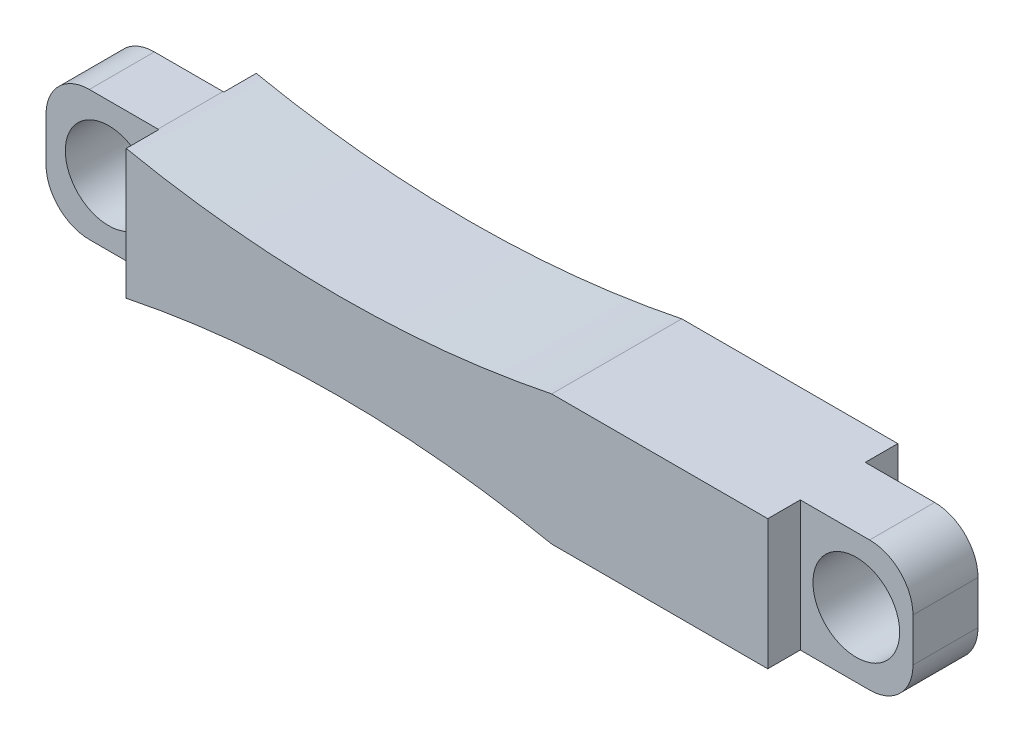
ISO-10303-21;
HEADER;
FILE_DESCRIPTION(('STEP AP214'),'2;1');
FILE_NAME('part.step','',(''),(''),'','','');
FILE_SCHEMA(('AUTOMOTIVE_DESIGN { 1 0 10303 214 1 1 1 1 }'));
ENDSEC;
DATA;
#1=APPLICATION_CONTEXT('core data for automotive mechanical design processes');
#2=APPLICATION_PROTOCOL_DEFINITION('international standard','automotive_design',2000,#1);
#3=PRODUCT_CONTEXT('',#1,'mechanical');
#4=PRODUCT('Part','Part','',(#3));
#5=PRODUCT_RELATED_PRODUCT_CATEGORY('part','',(#4));
#6=PRODUCT_DEFINITION_FORMATION('','',#4);
#7=PRODUCT_DEFINITION_CONTEXT('part definition',#1,'design');
#8=PRODUCT_DEFINITION('design','',#6,#7);
#9=PRODUCT_DEFINITION_SHAPE('','',#8);
#10=(LENGTH_UNIT() NAMED_UNIT(*) SI_UNIT(.MILLI.,.METRE.));
#11=(NAMED_UNIT(*) PLANE_ANGLE_UNIT() SI_UNIT($,.RADIAN.));
#12=(NAMED_UNIT(*) SI_UNIT($,.STERADIAN.) SOLID_ANGLE_UNIT());
#13=UNCERTAINTY_MEASURE_WITH_UNIT(LENGTH_MEASURE(1.E-05),#10,'distance_accuracy_value','');
#14=(GEOMETRIC_REPRESENTATION_CONTEXT(3) GLOBAL_UNCERTAINTY_ASSIGNED_CONTEXT((#13)) GLOBAL_UNIT_ASSIGNED_CONTEXT((#10,
#11,#12)) REPRESENTATION_CONTEXT('',''));
#15=CARTESIAN_POINT('',(0.,0.,0.));
#16=DIRECTION('',(0.,0.,1.));
#17=DIRECTION('',(1.,0.,0.));
#18=AXIS2_PLACEMENT_3D('',#15,#16,#17);
#19=CARTESIAN_POINT('',(-150.33482437737,14.3918732714698,75.));
#20=DIRECTION('',(0.,0.,1.));
#21=DIRECTION('',(1.,0.,0.));
#22=AXIS2_PLACEMENT_3D('',#19,#20,#21);
#23=PLANE('',#22);
#24=CARTESIAN_POINT('',(-65.295953132402,1011.91743228915,75.));
#25=DIRECTION('',(0.,0.,1.));
#26=DIRECTION('',(1.,0.,0.));
#27=AXIS2_PLACEMENT_3D('',#24,#25,#26);
#28=CIRCLE('',#27,976.713794307517);
#29=CARTESIAN_POINT('',(-261.295953153205,55.071657891603,75.));
#30=VERTEX_POINT('',#29);
#31=CARTESIAN_POINT('',(131.347256168401,55.2036379773523,75.));
#32=VERTEX_POINT('',#31);
#33=EDGE_CURVE('E284',#30,#32,#28,.T.);
#34=ORIENTED_EDGE('',*,*,#33,.F.);
#35=DIRECTION('',(0.,1.,0.));
#36=VECTOR('',#35,1.);
#37=CARTESIAN_POINT('',(-261.295953153205,55.2036379773522,75.));
#38=LINE('',#37,#36);
#39=CARTESIAN_POINT('',(-261.295953153205,-64.6644182061334,75.));
#40=VERTEX_POINT('',#39);
#41=EDGE_CURVE('E65',#40,#30,#38,.T.);
#42=ORIENTED_EDGE('',*,*,#41,.F.);
#43=CARTESIAN_POINT('',(-65.2959531532047,-1021.77323976221,75.));
#44=DIRECTION('',(0.,0.,1.));
#45=DIRECTION('',(-1.,0.,0.));
#46=AXIS2_PLACEMENT_3D('',#43,#44,#45);
#47=CIRCLE('',#46,976.97149206129);
#48=CARTESIAN_POINT('',(131.347256168401,-64.7963620226478,75.));
#49=VERTEX_POINT('',#48);
#50=EDGE_CURVE('E279',#49,#40,#47,.T.);
#51=ORIENTED_EDGE('',*,*,#50,.F.);
#52=DIRECTION('',(1.,0.,0.));
#53=VECTOR('',#52,1.);
#54=CARTESIAN_POINT('',(-365.295953153205,-64.7963620226478,75.));
#55=LINE('',#54,#53);
#56=CARTESIAN_POINT('',(330.704046846795,-64.7963620226478,75.));
#57=VERTEX_POINT('',#56);
#58=EDGE_CURVE('E306',#49,#57,#55,.T.);
#59=ORIENTED_EDGE('',*,*,#58,.T.);
#60=DIRECTION('',(0.,-1.,0.));
#61=VECTOR('',#60,1.);
#62=CARTESIAN_POINT('',(330.704046846795,55.2036379773522,75.));
#63=LINE('',#62,#61);
#64=CARTESIAN_POINT('',(330.704046846795,55.2036379773522,75.));
#65=VERTEX_POINT('',#64);
#66=EDGE_CURVE('E259',#65,#57,#63,.T.);
#67=ORIENTED_EDGE('',*,*,#66,.F.);
#68=DIRECTION('',(-1.,0.,0.));
#69=VECTOR('',#68,1.);
#70=CARTESIAN_POINT('',(-365.295953153205,55.2036379773522,75.));
#71=LINE('',#70,#69);
#72=EDGE_CURVE('E310',#65,#32,#71,.T.);
#73=ORIENTED_EDGE('',*,*,#72,.T.);
#74=EDGE_LOOP('',(#34,#42,#51,#59,#67,#73));
#75=FACE_BOUND('',#74,.T.);
#76=ADVANCED_FACE('F39',(#75),#23,.T.);
#77=CARTESIAN_POINT('',(-150.33482437737,14.3918732714698,-45.));
#78=DIRECTION('',(0.,0.,1.));
#79=DIRECTION('',(1.,0.,0.));
#80=AXIS2_PLACEMENT_3D('',#77,#78,#79);
#81=PLANE('',#80);
#82=CARTESIAN_POINT('',(-65.2959531532047,-1021.77323976221,-45.));
#83=DIRECTION('',(0.,0.,1.));
#84=DIRECTION('',(-1.,0.,0.));
#85=AXIS2_PLACEMENT_3D('',#82,#83,#84);
#86=CIRCLE('',#85,976.97149206129);
#87=CARTESIAN_POINT('',(131.347256168401,-64.7963620226478,-45.));
#88=VERTEX_POINT('',#87);
#89=CARTESIAN_POINT('',(-261.295953153205,-64.6644182061334,-45.));
#90=VERTEX_POINT('',#89);
#91=EDGE_CURVE('E296',#88,#90,#86,.T.);
#92=ORIENTED_EDGE('',*,*,#91,.T.);
#93=DIRECTION('',(0.,-1.,0.));
#94=VECTOR('',#93,1.);
#95=CARTESIAN_POINT('',(-261.295953153205,55.2036379773522,-45.));
#96=LINE('',#95,#94);
#97=CARTESIAN_POINT('',(-261.295953153205,55.0716578916029,-45.));
#98=VERTEX_POINT('',#97);
#99=EDGE_CURVE('E180',#98,#90,#96,.T.);
#100=ORIENTED_EDGE('',*,*,#99,.F.);
#101=CARTESIAN_POINT('',(-65.295953132402,1011.91743228915,-45.));
#102=DIRECTION('',(0.,0.,1.));
#103=DIRECTION('',(1.,0.,0.));
#104=AXIS2_PLACEMENT_3D('',#101,#102,#103);
#105=CIRCLE('',#104,976.713794307517);
#106=CARTESIAN_POINT('',(131.347256168401,55.2036379773522,-45.));
#107=VERTEX_POINT('',#106);
#108=EDGE_CURVE('E280',#98,#107,#105,.T.);
#109=ORIENTED_EDGE('',*,*,#108,.T.);
#110=DIRECTION('',(-1.,0.,0.));
#111=VECTOR('',#110,1.);
#112=CARTESIAN_POINT('',(-365.295953153205,55.2036379773522,-45.));
#113=LINE('',#112,#111);
#114=CARTESIAN_POINT('',(330.704046846795,55.2036379773522,-45.));
#115=VERTEX_POINT('',#114);
#116=EDGE_CURVE('E311',#115,#107,#113,.T.);
#117=ORIENTED_EDGE('',*,*,#116,.F.);
#118=DIRECTION('',(0.,1.,0.));
#119=VECTOR('',#118,1.);
#120=CARTESIAN_POINT('',(330.704046846795,55.2036379773522,-45.));
#121=LINE('',#120,#119);
#122=CARTESIAN_POINT('',(330.704046846795,-64.7963620226478,-45.));
#123=VERTEX_POINT('',#122);
#124=EDGE_CURVE('E226',#123,#115,#121,.T.);
#125=ORIENTED_EDGE('',*,*,#124,.F.);
#126=DIRECTION('',(1.,0.,0.));
#127=VECTOR('',#126,1.);
#128=CARTESIAN_POINT('',(-365.295953153205,-64.7963620226478,-45.));
#129=LINE('',#128,#127);
#130=EDGE_CURVE('E292',#88,#123,#129,.T.);
#131=ORIENTED_EDGE('',*,*,#130,.F.);
#132=EDGE_LOOP('',(#92,#100,#109,#117,#125,#131));
#133=FACE_BOUND('',#132,.T.);
#134=ADVANCED_FACE('F433',(#133),#81,.F.);
#135=CARTESIAN_POINT('',(-365.295953153205,-64.7963620226478,75.));
#136=DIRECTION('',(0.,1.,0.));
#137=DIRECTION('',(0.,0.,1.));
#138=AXIS2_PLACEMENT_3D('',#135,#136,#137);
#139=PLANE('',#138);
#140=DIRECTION('',(0.,0.,1.));
#141=VECTOR('',#140,1.);
#142=CARTESIAN_POINT('',(-261.93916247481,-64.7963620226478,-45.));
#143=LINE('',#142,#141);
#144=CARTESIAN_POINT('',(-261.93916247481,-64.7963620226478,-15.));
#145=VERTEX_POINT('',#144);
#146=CARTESIAN_POINT('',(-261.93916247481,-64.7963620226478,45.));
#147=VERTEX_POINT('',#146);
#148=EDGE_CURVE('E202',#145,#147,#143,.T.);
#149=ORIENTED_EDGE('',*,*,#148,.T.);
#150=DIRECTION('',(-1.,0.,0.));
#151=VECTOR('',#150,1.);
#152=CARTESIAN_POINT('',(-261.295953153205,-64.7963620226478,45.));
#153=LINE('',#152,#151);
#154=CARTESIAN_POINT('',(-325.295953153205,-64.7963620226478,45.));
#155=VERTEX_POINT('',#154);
#156=EDGE_CURVE('E186',#147,#155,#153,.T.);
#157=ORIENTED_EDGE('',*,*,#156,.T.);
#158=DIRECTION('',(0.,0.,-1.));
#159=VECTOR('',#158,1.);
#160=CARTESIAN_POINT('',(-325.295953153205,-64.7963620226478,75.));
#161=LINE('',#160,#159);
#162=CARTESIAN_POINT('',(-325.295953153205,-64.7963620226478,-15.));
#163=VERTEX_POINT('',#162);
#164=EDGE_CURVE('E341',#155,#163,#161,.T.);
#165=ORIENTED_EDGE('',*,*,#164,.T.);
#166=DIRECTION('',(-1.,0.,0.));
#167=VECTOR('',#166,1.);
#168=CARTESIAN_POINT('',(-261.295953153205,-64.7963620226478,-15.));
#169=LINE('',#168,#167);
#170=EDGE_CURVE('E393',#145,#163,#169,.T.);
#171=ORIENTED_EDGE('',*,*,#170,.F.);
#172=EDGE_LOOP('',(#149,#157,#165,#171));
#173=FACE_BOUND('',#172,.T.);
#174=ADVANCED_FACE('F430',(#173),#139,.F.);
#175=CARTESIAN_POINT('',(-365.295953153205,55.2036379773522,75.));
#176=DIRECTION('',(0.,-1.,0.));
#177=DIRECTION('',(0.,0.,-1.));
#178=AXIS2_PLACEMENT_3D('',#175,#176,#177);
#179=PLANE('',#178);
#180=DIRECTION('',(0.,0.,-1.));
#181=VECTOR('',#180,1.);
#182=CARTESIAN_POINT('',(394.704046846795,55.2036379773522,75.));
#183=LINE('',#182,#181);
#184=CARTESIAN_POINT('',(394.704046846795,55.2036379773522,45.));
#185=VERTEX_POINT('',#184);
#186=CARTESIAN_POINT('',(394.704046846795,55.2036379773522,-15.));
#187=VERTEX_POINT('',#186);
#188=EDGE_CURVE('E329',#185,#187,#183,.T.);
#189=ORIENTED_EDGE('',*,*,#188,.T.);
#190=DIRECTION('',(1.,0.,0.));
#191=VECTOR('',#190,1.);
#192=CARTESIAN_POINT('',(330.704046846795,55.2036379773522,-15.));
#193=LINE('',#192,#191);
#194=CARTESIAN_POINT('',(330.704046846795,55.2036379773522,-15.));
#195=VERTEX_POINT('',#194);
#196=EDGE_CURVE('E241',#195,#187,#193,.T.);
#197=ORIENTED_EDGE('',*,*,#196,.F.);
#198=DIRECTION('',(0.,0.,1.));
#199=VECTOR('',#198,1.);
#200=CARTESIAN_POINT('',(330.704046846795,55.2036379773522,-15.));
#201=LINE('',#200,#199);
#202=EDGE_CURVE('E229',#115,#195,#201,.T.);
#203=ORIENTED_EDGE('',*,*,#202,.F.);
#204=ORIENTED_EDGE('',*,*,#116,.T.);
#205=DIRECTION('',(0.,0.,1.));
#206=VECTOR('',#205,1.);
#207=CARTESIAN_POINT('',(131.347256168401,55.2036379773523,-45.));
#208=LINE('',#207,#206);
#209=EDGE_CURVE('E283',#107,#32,#208,.T.);
#210=ORIENTED_EDGE('',*,*,#209,.T.);
#211=ORIENTED_EDGE('',*,*,#72,.F.);
#212=DIRECTION('',(0.,0.,1.));
#213=VECTOR('',#212,1.);
#214=CARTESIAN_POINT('',(330.704046846795,55.2036379773522,45.));
#215=LINE('',#214,#213);
#216=CARTESIAN_POINT('',(330.704046846795,55.2036379773522,45.));
#217=VERTEX_POINT('',#216);
#218=EDGE_CURVE('E256',#217,#65,#215,.T.);
#219=ORIENTED_EDGE('',*,*,#218,.F.);
#220=DIRECTION('',(1.,0.,0.));
#221=VECTOR('',#220,1.);
#222=CARTESIAN_POINT('',(330.704046846795,55.2036379773522,45.));
#223=LINE('',#222,#221);
#224=EDGE_CURVE('E266',#217,#185,#223,.T.);
#225=ORIENTED_EDGE('',*,*,#224,.T.);
#226=EDGE_LOOP('',(#189,#197,#203,#204,#210,#211,#219,#225));
#227=FACE_BOUND('',#226,.T.);
#228=ADVANCED_FACE('F432',(#227),#179,.F.);
#229=CARTESIAN_POINT('',(-365.295953153205,55.2036379773522,75.));
#230=DIRECTION('',(1.,0.,0.));
#231=DIRECTION('',(0.,0.,-1.));
#232=AXIS2_PLACEMENT_3D('',#229,#230,#231);
#233=PLANE('',#232);
#234=DIRECTION('',(0.,0.,-1.));
#235=VECTOR('',#234,1.);
#236=CARTESIAN_POINT('',(-365.295953153205,-24.7963620226478,75.));
#237=LINE('',#236,#235);
#238=CARTESIAN_POINT('',(-365.295953153205,-24.7963620226478,-15.));
#239=VERTEX_POINT('',#238);
#240=CARTESIAN_POINT('',(-365.295953153205,-24.7963620226478,45.));
#241=VERTEX_POINT('',#240);
#242=EDGE_CURVE('E315',#239,#241,#237,.F.);
#243=ORIENTED_EDGE('',*,*,#242,.T.);
#244=DIRECTION('',(0.,-1.,0.));
#245=VECTOR('',#244,1.);
#246=CARTESIAN_POINT('',(-365.295953153205,55.2036379773522,45.));
#247=LINE('',#246,#245);
#248=CARTESIAN_POINT('',(-365.295953153205,15.2036379773522,45.));
#249=VERTEX_POINT('',#248);
#250=EDGE_CURVE('E386',#249,#241,#247,.T.);
#251=ORIENTED_EDGE('',*,*,#250,.F.);
#252=DIRECTION('',(0.,0.,-1.));
#253=VECTOR('',#252,1.);
#254=CARTESIAN_POINT('',(-365.295953153205,15.2036379773522,75.));
#255=LINE('',#254,#253);
#256=CARTESIAN_POINT('',(-365.295953153205,15.2036379773522,-15.));
#257=VERTEX_POINT('',#256);
#258=EDGE_CURVE('E325',#249,#257,#255,.T.);
#259=ORIENTED_EDGE('',*,*,#258,.T.);
#260=DIRECTION('',(0.,1.,0.));
#261=VECTOR('',#260,1.);
#262=CARTESIAN_POINT('',(-365.295953153205,55.2036379773522,-15.));
#263=LINE('',#262,#261);
#264=EDGE_CURVE('E195',#239,#257,#263,.T.);
#265=ORIENTED_EDGE('',*,*,#264,.F.);
#266=EDGE_LOOP('',(#243,#251,#259,#265));
#267=FACE_BOUND('',#266,.T.);
#268=ADVANCED_FACE('F422',(#267),#233,.F.);
#269=DIRECTION('',(0.,0.,-1.));
#270=VECTOR('',#269,1.);
#271=CARTESIAN_POINT('',(330.704046846795,-64.7963620226478,-15.));
#272=LINE('',#271,#270);
#273=CARTESIAN_POINT('',(330.704046846795,-64.7963620226478,-15.));
#274=VERTEX_POINT('',#273);
#275=EDGE_CURVE('E238',#274,#123,#272,.T.);
#276=ORIENTED_EDGE('',*,*,#275,.F.);
#277=DIRECTION('',(1.,0.,0.));
#278=VECTOR('',#277,1.);
#279=CARTESIAN_POINT('',(330.704046846795,-64.7963620226478,-15.));
#280=LINE('',#279,#278);
#281=CARTESIAN_POINT('',(394.704046846795,-64.7963620226478,-15.));
#282=VERTEX_POINT('',#281);
#283=EDGE_CURVE('E245',#274,#282,#280,.T.);
#284=ORIENTED_EDGE('',*,*,#283,.T.);
#285=DIRECTION('',(0.,0.,-1.));
#286=VECTOR('',#285,1.);
#287=CARTESIAN_POINT('',(394.704046846795,-64.7963620226478,75.));
#288=LINE('',#287,#286);
#289=CARTESIAN_POINT('',(394.704046846795,-64.7963620226478,45.));
#290=VERTEX_POINT('',#289);
#291=EDGE_CURVE('E337',#282,#290,#288,.F.);
#292=ORIENTED_EDGE('',*,*,#291,.T.);
#293=DIRECTION('',(1.,0.,0.));
#294=VECTOR('',#293,1.);
#295=CARTESIAN_POINT('',(330.704046846795,-64.7963620226478,45.));
#296=LINE('',#295,#294);
#297=CARTESIAN_POINT('',(330.704046846795,-64.7963620226478,45.));
#298=VERTEX_POINT('',#297);
#299=EDGE_CURVE('E244',#298,#290,#296,.T.);
#300=ORIENTED_EDGE('',*,*,#299,.F.);
#301=DIRECTION('',(0.,0.,-1.));
#302=VECTOR('',#301,1.);
#303=CARTESIAN_POINT('',(330.704046846795,-64.7963620226478,45.));
#304=LINE('',#303,#302);
#305=EDGE_CURVE('E262',#57,#298,#304,.T.);
#306=ORIENTED_EDGE('',*,*,#305,.F.);
#307=ORIENTED_EDGE('',*,*,#58,.F.);
#308=DIRECTION('',(0.,0.,1.));
#309=VECTOR('',#308,1.);
#310=CARTESIAN_POINT('',(131.347256168401,-64.7963620226478,-45.));
#311=LINE('',#310,#309);
#312=EDGE_CURVE('E287',#88,#49,#311,.T.);
#313=ORIENTED_EDGE('',*,*,#312,.F.);
#314=ORIENTED_EDGE('',*,*,#130,.T.);
#315=EDGE_LOOP('',(#276,#284,#292,#300,#306,#307,#313,#314));
#316=FACE_BOUND('',#315,.T.);
#317=ADVANCED_FACE('F435',(#316),#139,.F.);
#318=CARTESIAN_POINT('',(434.704046846795,55.2036379773522,75.));
#319=DIRECTION('',(-1.,0.,0.));
#320=DIRECTION('',(0.,0.,1.));
#321=AXIS2_PLACEMENT_3D('',#318,#319,#320);
#322=PLANE('',#321);
#323=DIRECTION('',(0.,0.,-1.));
#324=VECTOR('',#323,1.);
#325=CARTESIAN_POINT('',(434.704046846795,-24.7963620226478,75.));
#326=LINE('',#325,#324);
#327=CARTESIAN_POINT('',(434.704046846795,-24.7963620226478,45.));
#328=VERTEX_POINT('',#327);
#329=CARTESIAN_POINT('',(434.704046846795,-24.7963620226478,-15.));
#330=VERTEX_POINT('',#329);
#331=EDGE_CURVE('E349',#328,#330,#326,.T.);
#332=ORIENTED_EDGE('',*,*,#331,.T.);
#333=DIRECTION('',(0.,-1.,0.));
#334=VECTOR('',#333,1.);
#335=CARTESIAN_POINT('',(434.704046846795,55.2036379773522,-15.));
#336=LINE('',#335,#334);
#337=CARTESIAN_POINT('',(434.704046846795,15.2036379773522,-15.));
#338=VERTEX_POINT('',#337);
#339=EDGE_CURVE('E230',#338,#330,#336,.T.);
#340=ORIENTED_EDGE('',*,*,#339,.F.);
#341=DIRECTION('',(0.,0.,-1.));
#342=VECTOR('',#341,1.);
#343=CARTESIAN_POINT('',(434.704046846795,15.2036379773522,75.));
#344=LINE('',#343,#342);
#345=CARTESIAN_POINT('',(434.704046846795,15.2036379773522,45.));
#346=VERTEX_POINT('',#345);
#347=EDGE_CURVE('E345',#338,#346,#344,.F.);
#348=ORIENTED_EDGE('',*,*,#347,.T.);
#349=DIRECTION('',(0.,1.,0.));
#350=VECTOR('',#349,1.);
#351=CARTESIAN_POINT('',(434.704046846795,55.2036379773522,45.));
#352=LINE('',#351,#350);
#353=EDGE_CURVE('E225',#328,#346,#352,.T.);
#354=ORIENTED_EDGE('',*,*,#353,.F.);
#355=EDGE_LOOP('',(#332,#340,#348,#354));
#356=FACE_BOUND('',#355,.T.);
#357=ADVANCED_FACE('F447',(#356),#322,.F.);
#358=DIRECTION('',(0.,0.,-1.));
#359=VECTOR('',#358,1.);
#360=CARTESIAN_POINT('',(-325.295953153205,55.2036379773522,75.));
#361=LINE('',#360,#359);
#362=CARTESIAN_POINT('',(-325.295953153205,55.2036379773522,-15.));
#363=VERTEX_POINT('',#362);
#364=CARTESIAN_POINT('',(-325.295953153205,55.2036379773522,45.));
#365=VERTEX_POINT('',#364);
#366=EDGE_CURVE('E333',#363,#365,#361,.F.);
#367=ORIENTED_EDGE('',*,*,#366,.T.);
#368=DIRECTION('',(-1.,0.,0.));
#369=VECTOR('',#368,1.);
#370=CARTESIAN_POINT('',(-261.295953153205,55.2036379773522,45.));
#371=LINE('',#370,#369);
#372=CARTESIAN_POINT('',(-261.939162433204,55.2036379773522,45.));
#373=VERTEX_POINT('',#372);
#374=EDGE_CURVE('E390',#373,#365,#371,.T.);
#375=ORIENTED_EDGE('',*,*,#374,.F.);
#376=DIRECTION('',(0.,0.,1.));
#377=VECTOR('',#376,1.);
#378=CARTESIAN_POINT('',(-261.939162433205,55.2036379773522,-45.));
#379=LINE('',#378,#377);
#380=CARTESIAN_POINT('',(-261.939162433204,55.2036379773522,-15.));
#381=VERTEX_POINT('',#380);
#382=EDGE_CURVE('E288',#381,#373,#379,.T.);
#383=ORIENTED_EDGE('',*,*,#382,.F.);
#384=DIRECTION('',(-1.,0.,0.));
#385=VECTOR('',#384,1.);
#386=CARTESIAN_POINT('',(-261.295953153205,55.2036379773522,-15.));
#387=LINE('',#386,#385);
#388=EDGE_CURVE('E401',#381,#363,#387,.T.);
#389=ORIENTED_EDGE('',*,*,#388,.T.);
#390=EDGE_LOOP('',(#367,#375,#383,#389));
#391=FACE_BOUND('',#390,.T.);
#392=ADVANCED_FACE('F410',(#391),#179,.F.);
#393=CARTESIAN_POINT('',(-325.295953153205,15.2036379773522,75.));
#394=DIRECTION('',(0.,0.,-1.));
#395=DIRECTION('',(-1.,0.,0.));
#396=AXIS2_PLACEMENT_3D('',#393,#394,#395);
#397=CYLINDRICAL_SURFACE('',#396,40.);
#398=CARTESIAN_POINT('',(-325.295953153205,15.2036379773522,45.));
#399=DIRECTION('',(0.,0.,-1.));
#400=DIRECTION('',(-1.,0.,0.));
#401=AXIS2_PLACEMENT_3D('',#398,#399,#400);
#402=CIRCLE('',#401,40.);
#403=EDGE_CURVE('E222',#365,#249,#402,.F.);
#404=ORIENTED_EDGE('',*,*,#403,.F.);
#405=ORIENTED_EDGE('',*,*,#366,.F.);
#406=CARTESIAN_POINT('',(-325.295953153205,15.2036379773522,-15.));
#407=DIRECTION('',(0.,0.,1.));
#408=DIRECTION('',(1.,0.,0.));
#409=AXIS2_PLACEMENT_3D('',#406,#407,#408);
#410=CIRCLE('',#409,40.);
#411=EDGE_CURVE('E207',#257,#363,#410,.F.);
#412=ORIENTED_EDGE('',*,*,#411,.F.);
#413=ORIENTED_EDGE('',*,*,#258,.F.);
#414=EDGE_LOOP('',(#404,#405,#412,#413));
#415=FACE_BOUND('',#414,.T.);
#416=ADVANCED_FACE('F415',(#415),#397,.T.);
#417=CARTESIAN_POINT('',(-325.295953153205,-24.7963620226478,75.));
#418=DIRECTION('',(0.,0.,-1.));
#419=DIRECTION('',(-1.,0.,0.));
#420=AXIS2_PLACEMENT_3D('',#417,#418,#419);
#421=CYLINDRICAL_SURFACE('',#420,40.);
#422=CARTESIAN_POINT('',(-325.295953153205,-24.7963620226478,45.));
#423=DIRECTION('',(0.,0.,-1.));
#424=DIRECTION('',(-1.,0.,0.));
#425=AXIS2_PLACEMENT_3D('',#422,#423,#424);
#426=CIRCLE('',#425,40.);
#427=EDGE_CURVE('E219',#241,#155,#426,.F.);
#428=ORIENTED_EDGE('',*,*,#427,.F.);
#429=ORIENTED_EDGE('',*,*,#242,.F.);
#430=CARTESIAN_POINT('',(-325.295953153205,-24.7963620226478,-15.));
#431=DIRECTION('',(0.,0.,1.));
#432=DIRECTION('',(1.,0.,0.));
#433=AXIS2_PLACEMENT_3D('',#430,#431,#432);
#434=CIRCLE('',#433,40.);
#435=EDGE_CURVE('E204',#163,#239,#434,.F.);
#436=ORIENTED_EDGE('',*,*,#435,.F.);
#437=ORIENTED_EDGE('',*,*,#164,.F.);
#438=EDGE_LOOP('',(#428,#429,#436,#437));
#439=FACE_BOUND('',#438,.T.);
#440=ADVANCED_FACE('F427',(#439),#421,.T.);
#441=CARTESIAN_POINT('',(394.704046846795,-24.7963620226478,75.));
#442=DIRECTION('',(0.,0.,-1.));
#443=DIRECTION('',(-1.,0.,0.));
#444=AXIS2_PLACEMENT_3D('',#441,#442,#443);
#445=CYLINDRICAL_SURFACE('',#444,40.);
#446=CARTESIAN_POINT('',(394.704046846795,-24.7963620226478,-15.));
#447=DIRECTION('',(0.,0.,1.));
#448=DIRECTION('',(1.,0.,0.));
#449=AXIS2_PLACEMENT_3D('',#446,#447,#448);
#450=CIRCLE('',#449,40.);
#451=EDGE_CURVE('E276',#330,#282,#450,.F.);
#452=ORIENTED_EDGE('',*,*,#451,.F.);
#453=ORIENTED_EDGE('',*,*,#331,.F.);
#454=CARTESIAN_POINT('',(394.704046846795,-24.7963620226478,45.));
#455=DIRECTION('',(0.,0.,-1.));
#456=DIRECTION('',(-1.,0.,0.));
#457=AXIS2_PLACEMENT_3D('',#454,#455,#456);
#458=CIRCLE('',#457,40.);
#459=EDGE_CURVE('E249',#290,#328,#458,.F.);
#460=ORIENTED_EDGE('',*,*,#459,.F.);
#461=ORIENTED_EDGE('',*,*,#291,.F.);
#462=EDGE_LOOP('',(#452,#453,#460,#461));
#463=FACE_BOUND('',#462,.T.);
#464=ADVANCED_FACE('F469',(#463),#445,.T.);
#465=CARTESIAN_POINT('',(394.704046846795,15.2036379773522,75.));
#466=DIRECTION('',(0.,0.,-1.));
#467=DIRECTION('',(-1.,0.,0.));
#468=AXIS2_PLACEMENT_3D('',#465,#466,#467);
#469=CYLINDRICAL_SURFACE('',#468,40.);
#470=CARTESIAN_POINT('',(394.704046846795,15.2036379773522,-15.));
#471=DIRECTION('',(0.,0.,1.));
#472=DIRECTION('',(1.,0.,0.));
#473=AXIS2_PLACEMENT_3D('',#470,#471,#472);
#474=CIRCLE('',#473,40.);
#475=EDGE_CURVE('E356',#187,#338,#474,.F.);
#476=ORIENTED_EDGE('',*,*,#475,.F.);
#477=ORIENTED_EDGE('',*,*,#188,.F.);
#478=CARTESIAN_POINT('',(394.704046846795,15.2036379773522,45.));
#479=DIRECTION('',(0.,0.,-1.));
#480=DIRECTION('',(-1.,0.,0.));
#481=AXIS2_PLACEMENT_3D('',#478,#479,#480);
#482=CIRCLE('',#481,40.);
#483=EDGE_CURVE('E353',#346,#185,#482,.F.);
#484=ORIENTED_EDGE('',*,*,#483,.F.);
#485=ORIENTED_EDGE('',*,*,#347,.F.);
#486=EDGE_LOOP('',(#476,#477,#484,#485));
#487=FACE_BOUND('',#486,.T.);
#488=ADVANCED_FACE('F41',(#487),#469,.T.);
#489=CARTESIAN_POINT('',(-65.2959531532047,-1021.77323976221,-45.));
#490=DIRECTION('',(0.,0.,1.));
#491=DIRECTION('',(1.,0.,0.));
#492=AXIS2_PLACEMENT_3D('',#489,#490,#491);
#493=CYLINDRICAL_SURFACE('',#492,976.97149206129);
#494=DIRECTION('',(0.,0.,1.));
#495=VECTOR('',#494,1.);
#496=CARTESIAN_POINT('',(-261.295953153205,-64.6644182061334,-45.));
#497=LINE('',#496,#495);
#498=CARTESIAN_POINT('',(-261.295953153205,-64.6644182061334,45.));
#499=VERTEX_POINT('',#498);
#500=EDGE_CURVE('E213',#499,#40,#497,.T.);
#501=ORIENTED_EDGE('',*,*,#500,.F.);
#502=CARTESIAN_POINT('',(-65.2959531532047,-1021.77323976221,45.));
#503=DIRECTION('',(0.,0.,-1.));
#504=DIRECTION('',(-1.,0.,0.));
#505=AXIS2_PLACEMENT_3D('',#502,#503,#504);
#506=CIRCLE('',#505,976.97149206129);
#507=EDGE_CURVE('E216',#499,#147,#506,.F.);
#508=ORIENTED_EDGE('',*,*,#507,.T.);
#509=ORIENTED_EDGE('',*,*,#148,.F.);
#510=CARTESIAN_POINT('',(-65.2959531532047,-1021.77323976221,-15.));
#511=DIRECTION('',(0.,0.,1.));
#512=DIRECTION('',(1.,0.,0.));
#513=AXIS2_PLACEMENT_3D('',#510,#511,#512);
#514=CIRCLE('',#513,976.97149206129);
#515=CARTESIAN_POINT('',(-261.295953153205,-64.6644182061334,-15.));
#516=VERTEX_POINT('',#515);
#517=EDGE_CURVE('E185',#145,#516,#514,.F.);
#518=ORIENTED_EDGE('',*,*,#517,.T.);
#519=DIRECTION('',(0.,0.,1.));
#520=VECTOR('',#519,1.);
#521=CARTESIAN_POINT('',(-261.295953153205,-64.6644182061334,-45.));
#522=LINE('',#521,#520);
#523=EDGE_CURVE('E177',#516,#90,#522,.F.);
#524=ORIENTED_EDGE('',*,*,#523,.T.);
#525=ORIENTED_EDGE('',*,*,#91,.F.);
#526=ORIENTED_EDGE('',*,*,#312,.T.);
#527=ORIENTED_EDGE('',*,*,#50,.T.);
#528=EDGE_LOOP('',(#501,#508,#509,#518,#524,#525,#526,#527));
#529=FACE_BOUND('',#528,.T.);
#530=ADVANCED_FACE('F199',(#529),#493,.F.);
#531=CARTESIAN_POINT('',(-65.295953132402,1011.91743228915,-45.));
#532=DIRECTION('',(0.,0.,1.));
#533=DIRECTION('',(1.,0.,0.));
#534=AXIS2_PLACEMENT_3D('',#531,#532,#533);
#535=CYLINDRICAL_SURFACE('',#534,976.713794307517);
#536=ORIENTED_EDGE('',*,*,#382,.T.);
#537=CARTESIAN_POINT('',(-65.295953132402,1011.91743228915,45.));
#538=DIRECTION('',(0.,0.,-1.));
#539=DIRECTION('',(-1.,0.,0.));
#540=AXIS2_PLACEMENT_3D('',#537,#538,#539);
#541=CIRCLE('',#540,976.713794307517);
#542=CARTESIAN_POINT('',(-261.295953153205,55.0716578916029,45.));
#543=VERTEX_POINT('',#542);
#544=EDGE_CURVE('E11',#373,#543,#541,.F.);
#545=ORIENTED_EDGE('',*,*,#544,.T.);
#546=DIRECTION('',(0.,0.,1.));
#547=VECTOR('',#546,1.);
#548=CARTESIAN_POINT('',(-261.295953153205,55.0716578916029,-45.));
#549=LINE('',#548,#547);
#550=EDGE_CURVE('E49',#30,#543,#549,.F.);
#551=ORIENTED_EDGE('',*,*,#550,.F.);
#552=ORIENTED_EDGE('',*,*,#33,.T.);
#553=ORIENTED_EDGE('',*,*,#209,.F.);
#554=ORIENTED_EDGE('',*,*,#108,.F.);
#555=DIRECTION('',(0.,0.,1.));
#556=VECTOR('',#555,1.);
#557=CARTESIAN_POINT('',(-261.295953153205,55.0716578916029,-45.));
#558=LINE('',#557,#556);
#559=CARTESIAN_POINT('',(-261.295953153205,55.0716578916029,-15.));
#560=VERTEX_POINT('',#559);
#561=EDGE_CURVE('E359',#98,#560,#558,.T.);
#562=ORIENTED_EDGE('',*,*,#561,.T.);
#563=CARTESIAN_POINT('',(-65.295953132402,1011.91743228915,-15.));
#564=DIRECTION('',(0.,0.,1.));
#565=DIRECTION('',(1.,0.,0.));
#566=AXIS2_PLACEMENT_3D('',#563,#564,#565);
#567=CIRCLE('',#566,976.713794307517);
#568=EDGE_CURVE('E192',#560,#381,#567,.F.);
#569=ORIENTED_EDGE('',*,*,#568,.T.);
#570=EDGE_LOOP('',(#536,#545,#551,#552,#553,#554,#562,#569));
#571=FACE_BOUND('',#570,.T.);
#572=ADVANCED_FACE('F487',(#571),#535,.F.);
#573=CARTESIAN_POINT('',(330.704046846795,55.2036379773522,45.));
#574=DIRECTION('',(0.,0.,-1.));
#575=DIRECTION('',(-1.,0.,0.));
#576=AXIS2_PLACEMENT_3D('',#573,#574,#575);
#577=PLANE('',#576);
#578=CARTESIAN_POINT('',(382.404116113215,-4.79636202264784,45.));
#579=DIRECTION('',(0.,0.,-1.));
#580=DIRECTION('',(-1.,0.,0.));
#581=AXIS2_PLACEMENT_3D('',#578,#579,#580);
#582=CIRCLE('',#581,40.);
#583=CARTESIAN_POINT('',(422.404116113215,-4.79636202264784,45.));
#584=VERTEX_POINT('',#583);
#585=EDGE_CURVE('E378',#584,#584,#582,.T.);
#586=ORIENTED_EDGE('',*,*,#585,.T.);
#587=EDGE_LOOP('',(#586));
#588=FACE_BOUND('',#587,.T.);
#589=ORIENTED_EDGE('',*,*,#459,.T.);
#590=ORIENTED_EDGE('',*,*,#353,.T.);
#591=ORIENTED_EDGE('',*,*,#483,.T.);
#592=ORIENTED_EDGE('',*,*,#224,.F.);
#593=DIRECTION('',(0.,1.,0.));
#594=VECTOR('',#593,1.);
#595=CARTESIAN_POINT('',(330.704046846795,55.2036379773522,45.));
#596=LINE('',#595,#594);
#597=EDGE_CURVE('E252',#298,#217,#596,.T.);
#598=ORIENTED_EDGE('',*,*,#597,.F.);
#599=ORIENTED_EDGE('',*,*,#299,.T.);
#600=EDGE_LOOP('',(#589,#590,#591,#592,#598,#599));
#601=FACE_BOUND('',#600,.T.);
#602=ADVANCED_FACE('F495',(#588,#601),#577,.F.);
#603=CARTESIAN_POINT('',(330.704046846795,14.3918732714698,-45.));
#604=DIRECTION('',(-1.,0.,0.));
#605=DIRECTION('',(0.,0.,1.));
#606=AXIS2_PLACEMENT_3D('',#603,#604,#605);
#607=PLANE('',#606);
#608=ORIENTED_EDGE('',*,*,#597,.T.);
#609=ORIENTED_EDGE('',*,*,#218,.T.);
#610=ORIENTED_EDGE('',*,*,#66,.T.);
#611=ORIENTED_EDGE('',*,*,#305,.T.);
#612=EDGE_LOOP('',(#608,#609,#610,#611));
#613=FACE_BOUND('',#612,.T.);
#614=ADVANCED_FACE('F492',(#613),#607,.F.);
#615=CARTESIAN_POINT('',(330.704046846795,55.2036379773522,-15.));
#616=DIRECTION('',(0.,0.,1.));
#617=DIRECTION('',(1.,0.,0.));
#618=AXIS2_PLACEMENT_3D('',#615,#616,#617);
#619=PLANE('',#618);
#620=CARTESIAN_POINT('',(382.404116113215,-4.79636202264784,-15.));
#621=DIRECTION('',(0.,0.,1.));
#622=DIRECTION('',(1.,0.,0.));
#623=AXIS2_PLACEMENT_3D('',#620,#621,#622);
#624=CIRCLE('',#623,40.);
#625=CARTESIAN_POINT('',(422.404116113215,-4.79636202264784,-15.));
#626=VERTEX_POINT('',#625);
#627=EDGE_CURVE('E43',#626,#626,#624,.T.);
#628=ORIENTED_EDGE('',*,*,#627,.T.);
#629=EDGE_LOOP('',(#628));
#630=FACE_BOUND('',#629,.T.);
#631=ORIENTED_EDGE('',*,*,#451,.T.);
#632=ORIENTED_EDGE('',*,*,#283,.F.);
#633=DIRECTION('',(0.,-1.,0.));
#634=VECTOR('',#633,1.);
#635=CARTESIAN_POINT('',(330.704046846795,55.2036379773522,-15.));
#636=LINE('',#635,#634);
#637=EDGE_CURVE('E234',#195,#274,#636,.T.);
#638=ORIENTED_EDGE('',*,*,#637,.F.);
#639=ORIENTED_EDGE('',*,*,#196,.T.);
#640=ORIENTED_EDGE('',*,*,#475,.T.);
#641=ORIENTED_EDGE('',*,*,#339,.T.);
#642=EDGE_LOOP('',(#631,#632,#638,#639,#640,#641));
#643=FACE_BOUND('',#642,.T.);
#644=ADVANCED_FACE('F472',(#630,#643),#619,.F.);
#645=CARTESIAN_POINT('',(330.704046846795,14.3918732714698,-45.));
#646=DIRECTION('',(1.,0.,0.));
#647=DIRECTION('',(0.,0.,-1.));
#648=AXIS2_PLACEMENT_3D('',#645,#646,#647);
#649=PLANE('',#648);
#650=ORIENTED_EDGE('',*,*,#124,.T.);
#651=ORIENTED_EDGE('',*,*,#202,.T.);
#652=ORIENTED_EDGE('',*,*,#637,.T.);
#653=ORIENTED_EDGE('',*,*,#275,.T.);
#654=EDGE_LOOP('',(#650,#651,#652,#653));
#655=FACE_BOUND('',#654,.T.);
#656=ADVANCED_FACE('F479',(#655),#649,.T.);
#657=CARTESIAN_POINT('',(-261.295953153205,55.2036379773522,-15.));
#658=DIRECTION('',(0.,0.,1.));
#659=DIRECTION('',(1.,0.,0.));
#660=AXIS2_PLACEMENT_3D('',#657,#658,#659);
#661=PLANE('',#660);
#662=CARTESIAN_POINT('',(-307.479723604814,-4.79636202264783,-15.));
#663=DIRECTION('',(0.,0.,1.));
#664=DIRECTION('',(1.,0.,0.));
#665=AXIS2_PLACEMENT_3D('',#662,#663,#664);
#666=CIRCLE('',#665,40.);
#667=CARTESIAN_POINT('',(-267.479723604814,-4.79636202264783,-15.));
#668=VERTEX_POINT('',#667);
#669=EDGE_CURVE('E368',#668,#668,#666,.T.);
#670=ORIENTED_EDGE('',*,*,#669,.T.);
#671=EDGE_LOOP('',(#670));
#672=FACE_BOUND('',#671,.T.);
#673=ORIENTED_EDGE('',*,*,#411,.T.);
#674=ORIENTED_EDGE('',*,*,#388,.F.);
#675=ORIENTED_EDGE('',*,*,#568,.F.);
#676=DIRECTION('',(0.,1.,0.));
#677=VECTOR('',#676,1.);
#678=CARTESIAN_POINT('',(-261.295953153205,55.2036379773522,-15.));
#679=LINE('',#678,#677);
#680=EDGE_CURVE('E57',#516,#560,#679,.T.);
#681=ORIENTED_EDGE('',*,*,#680,.F.);
#682=ORIENTED_EDGE('',*,*,#517,.F.);
#683=ORIENTED_EDGE('',*,*,#170,.T.);
#684=ORIENTED_EDGE('',*,*,#435,.T.);
#685=ORIENTED_EDGE('',*,*,#264,.T.);
#686=EDGE_LOOP('',(#673,#674,#675,#681,#682,#683,#684,#685));
#687=FACE_BOUND('',#686,.T.);
#688=ADVANCED_FACE('F189',(#672,#687),#661,.F.);
#689=CARTESIAN_POINT('',(-261.295953153205,14.3918732714698,-45.));
#690=DIRECTION('',(1.,0.,0.));
#691=DIRECTION('',(0.,0.,-1.));
#692=AXIS2_PLACEMENT_3D('',#689,#690,#691);
#693=PLANE('',#692);
#694=ORIENTED_EDGE('',*,*,#680,.T.);
#695=ORIENTED_EDGE('',*,*,#561,.F.);
#696=ORIENTED_EDGE('',*,*,#99,.T.);
#697=ORIENTED_EDGE('',*,*,#523,.F.);
#698=EDGE_LOOP('',(#694,#695,#696,#697));
#699=FACE_BOUND('',#698,.T.);
#700=ADVANCED_FACE('F178',(#699),#693,.F.);
#701=CARTESIAN_POINT('',(-261.295953153205,55.2036379773522,45.));
#702=DIRECTION('',(0.,0.,-1.));
#703=DIRECTION('',(-1.,0.,0.));
#704=AXIS2_PLACEMENT_3D('',#701,#702,#703);
#705=PLANE('',#704);
#706=CARTESIAN_POINT('',(-307.479723604814,-4.79636202264783,45.));
#707=DIRECTION('',(0.,0.,-1.));
#708=DIRECTION('',(-1.,0.,0.));
#709=AXIS2_PLACEMENT_3D('',#706,#707,#708);
#710=CIRCLE('',#709,40.);
#711=CARTESIAN_POINT('',(-267.479723604814,-4.79636202264783,45.));
#712=VERTEX_POINT('',#711);
#713=EDGE_CURVE('E365',#712,#712,#710,.T.);
#714=ORIENTED_EDGE('',*,*,#713,.T.);
#715=EDGE_LOOP('',(#714));
#716=FACE_BOUND('',#715,.T.);
#717=ORIENTED_EDGE('',*,*,#403,.T.);
#718=ORIENTED_EDGE('',*,*,#250,.T.);
#719=ORIENTED_EDGE('',*,*,#427,.T.);
#720=ORIENTED_EDGE('',*,*,#156,.F.);
#721=ORIENTED_EDGE('',*,*,#507,.F.);
#722=DIRECTION('',(0.,-1.,0.));
#723=VECTOR('',#722,1.);
#724=CARTESIAN_POINT('',(-261.295953153205,55.2036379773522,45.));
#725=LINE('',#724,#723);
#726=EDGE_CURVE('E385',#543,#499,#725,.T.);
#727=ORIENTED_EDGE('',*,*,#726,.F.);
#728=ORIENTED_EDGE('',*,*,#544,.F.);
#729=ORIENTED_EDGE('',*,*,#374,.T.);
#730=EDGE_LOOP('',(#717,#718,#719,#720,#721,#727,#728,#729));
#731=FACE_BOUND('',#730,.T.);
#732=ADVANCED_FACE('F419',(#716,#731),#705,.F.);
#733=CARTESIAN_POINT('',(-261.295953153205,14.3918732714698,-45.));
#734=DIRECTION('',(-1.,0.,0.));
#735=DIRECTION('',(0.,0.,1.));
#736=AXIS2_PLACEMENT_3D('',#733,#734,#735);
#737=PLANE('',#736);
#738=ORIENTED_EDGE('',*,*,#500,.T.);
#739=ORIENTED_EDGE('',*,*,#41,.T.);
#740=ORIENTED_EDGE('',*,*,#550,.T.);
#741=ORIENTED_EDGE('',*,*,#726,.T.);
#742=EDGE_LOOP('',(#738,#739,#740,#741));
#743=FACE_BOUND('',#742,.T.);
#744=ADVANCED_FACE('F625',(#743),#737,.T.);
#745=CARTESIAN_POINT('',(-307.479723604814,-4.79636202264783,-105.));
#746=DIRECTION('',(0.,0.,1.));
#747=DIRECTION('',(1.,0.,0.));
#748=AXIS2_PLACEMENT_3D('',#745,#746,#747);
#749=CYLINDRICAL_SURFACE('',#748,40.);
#750=CARTESIAN_POINT('',(-267.479723604814,-4.79636202264783,45.));
#751=CARTESIAN_POINT('',(-267.479723604814,-4.79636202264783,44.375));
#752=CARTESIAN_POINT('',(-267.479723604814,-4.79636202264783,43.75));
#753=CARTESIAN_POINT('',(-267.479723604814,-4.79636202264783,42.5));
#754=CARTESIAN_POINT('',(-267.479723604814,-4.79636202264783,41.875));
#755=CARTESIAN_POINT('',(-267.479723604814,-4.79636202264783,40.625));
#756=CARTESIAN_POINT('',(-267.479723604814,-4.79636202264783,40.));
#757=CARTESIAN_POINT('',(-267.479723604814,-4.79636202264783,38.75));
#758=CARTESIAN_POINT('',(-267.479723604814,-4.79636202264783,38.125));
#759=CARTESIAN_POINT('',(-267.479723604814,-4.79636202264783,36.875));
#760=CARTESIAN_POINT('',(-267.479723604814,-4.79636202264783,36.25));
#761=CARTESIAN_POINT('',(-267.479723604814,-4.79636202264783,35.));
#762=CARTESIAN_POINT('',(-267.479723604814,-4.79636202264783,34.375));
#763=CARTESIAN_POINT('',(-267.479723604814,-4.79636202264783,33.125));
#764=CARTESIAN_POINT('',(-267.479723604814,-4.79636202264783,32.5));
#765=CARTESIAN_POINT('',(-267.479723604814,-4.79636202264783,31.25));
#766=CARTESIAN_POINT('',(-267.479723604814,-4.79636202264783,30.625));
#767=CARTESIAN_POINT('',(-267.479723604814,-4.79636202264783,29.375));
#768=CARTESIAN_POINT('',(-267.479723604814,-4.79636202264783,28.75));
#769=CARTESIAN_POINT('',(-267.479723604814,-4.79636202264783,27.5));
#770=CARTESIAN_POINT('',(-267.479723604814,-4.79636202264783,26.875));
#771=CARTESIAN_POINT('',(-267.479723604814,-4.79636202264783,25.625));
#772=CARTESIAN_POINT('',(-267.479723604814,-4.79636202264783,25.));
#773=CARTESIAN_POINT('',(-267.479723604814,-4.79636202264783,23.75));
#774=CARTESIAN_POINT('',(-267.479723604814,-4.79636202264783,23.125));
#775=CARTESIAN_POINT('',(-267.479723604814,-4.79636202264783,21.875));
#776=CARTESIAN_POINT('',(-267.479723604814,-4.79636202264783,21.25));
#777=CARTESIAN_POINT('',(-267.479723604814,-4.79636202264783,20.));
#778=CARTESIAN_POINT('',(-267.479723604814,-4.79636202264783,19.375));
#779=CARTESIAN_POINT('',(-267.479723604814,-4.79636202264783,18.125));
#780=CARTESIAN_POINT('',(-267.479723604814,-4.79636202264783,17.5));
#781=CARTESIAN_POINT('',(-267.479723604814,-4.79636202264783,16.25));
#782=CARTESIAN_POINT('',(-267.479723604814,-4.79636202264783,15.625));
#783=CARTESIAN_POINT('',(-267.479723604814,-4.79636202264783,14.375));
#784=CARTESIAN_POINT('',(-267.479723604814,-4.79636202264783,13.75));
#785=CARTESIAN_POINT('',(-267.479723604814,-4.79636202264783,12.5));
#786=CARTESIAN_POINT('',(-267.479723604814,-4.79636202264783,11.875));
#787=CARTESIAN_POINT('',(-267.479723604814,-4.79636202264783,10.625));
#788=CARTESIAN_POINT('',(-267.479723604814,-4.79636202264783,10.));
#789=CARTESIAN_POINT('',(-267.479723604814,-4.79636202264783,8.75000000000001));
#790=CARTESIAN_POINT('',(-267.479723604814,-4.79636202264783,8.12500000000001));
#791=CARTESIAN_POINT('',(-267.479723604814,-4.79636202264783,6.87500000000001));
#792=CARTESIAN_POINT('',(-267.479723604814,-4.79636202264783,6.25000000000001));
#793=CARTESIAN_POINT('',(-267.479723604814,-4.79636202264783,5.00000000000001));
#794=CARTESIAN_POINT('',(-267.479723604814,-4.79636202264783,4.37500000000001));
#795=CARTESIAN_POINT('',(-267.479723604814,-4.79636202264783,3.12500000000001));
#796=CARTESIAN_POINT('',(-267.479723604814,-4.79636202264783,2.50000000000001));
#797=CARTESIAN_POINT('',(-267.479723604814,-4.79636202264783,1.25000000000001));
#798=CARTESIAN_POINT('',(-267.479723604814,-4.79636202264783,0.62500000000001));
#799=CARTESIAN_POINT('',(-267.479723604814,-4.79636202264783,-0.624999999999991));
#800=CARTESIAN_POINT('',(-267.479723604814,-4.79636202264783,-1.25));
#801=CARTESIAN_POINT('',(-267.479723604814,-4.79636202264783,-2.5));
#802=CARTESIAN_POINT('',(-267.479723604814,-4.79636202264783,-3.12499999999999));
#803=CARTESIAN_POINT('',(-267.479723604814,-4.79636202264783,-4.37499999999999));
#804=CARTESIAN_POINT('',(-267.479723604814,-4.79636202264783,-5.));
#805=CARTESIAN_POINT('',(-267.479723604814,-4.79636202264783,-6.25));
#806=CARTESIAN_POINT('',(-267.479723604814,-4.79636202264783,-6.875));
#807=CARTESIAN_POINT('',(-267.479723604814,-4.79636202264783,-8.12499999999999));
#808=CARTESIAN_POINT('',(-267.479723604814,-4.79636202264783,-8.74999999999999));
#809=CARTESIAN_POINT('',(-267.479723604814,-4.79636202264783,-9.99999999999999));
#810=CARTESIAN_POINT('',(-267.479723604814,-4.79636202264783,-10.625));
#811=CARTESIAN_POINT('',(-267.479723604814,-4.79636202264783,-11.875));
#812=CARTESIAN_POINT('',(-267.479723604814,-4.79636202264783,-12.5));
#813=CARTESIAN_POINT('',(-267.479723604814,-4.79636202264783,-13.75));
#814=CARTESIAN_POINT('',(-267.479723604814,-4.79636202264783,-14.375));
#815=CARTESIAN_POINT('',(-267.479723604814,-4.79636202264783,-15.));
#816=B_SPLINE_CURVE_WITH_KNOTS('',3,(#750,#751,#752,#753,#754,#755,#756,#757,#758,#759,#760,
#761,#762,#763,#764,#765,#766,#767,#768,#769,#770,#771,#772,#773,#774,#775,#776,#777,#778,#779,
#780,#781,#782,#783,#784,#785,#786,#787,#788,#789,#790,#791,#792,#793,#794,#795,#796,#797,#798,
#799,#800,#801,#802,#803,#804,#805,#806,#807,#808,#809,#810,#811,#812,#813,#814,#815),
.UNSPECIFIED.,.F.,.F.,(4,2,2,2,2,2,2,2,2,2,2,2,2,2,2,2,2,2,2,2,2,2,2,2,2,2,2,2,2,2,2,2,4),(0.,
1.87499999999999,3.75,5.62499999999999,7.50000000000001,9.37499999999999,11.25,13.125,15.,
16.875,18.75,20.625,22.5,24.375,26.25,28.125,30.,31.875,33.75,35.625,37.5,39.375,41.25,43.125,
45.,46.875,48.75,50.625,52.5,54.375,56.25,58.125,60.),.UNSPECIFIED.);
#817=EDGE_CURVE('BSEAM634',#712,#668,#816,.T.);
#818=ORIENTED_EDGE('',*,*,#713,.F.);
#819=ORIENTED_EDGE('',*,*,#669,.F.);
#820=ORIENTED_EDGE('',*,*,#817,.T.);
#821=ORIENTED_EDGE('',*,*,#817,.F.);
#822=EDGE_LOOP('',(#818,#820,#819,#821));
#823=FACE_BOUND('',#822,.T.);
#824=ADVANCED_FACE('F634',(#823),#749,.F.);
#825=CARTESIAN_POINT('',(382.404116113215,-4.79636202264784,-105.));
#826=DIRECTION('',(0.,0.,1.));
#827=DIRECTION('',(1.,0.,0.));
#828=AXIS2_PLACEMENT_3D('',#825,#826,#827);
#829=CYLINDRICAL_SURFACE('',#828,40.);
#830=CARTESIAN_POINT('',(422.404116113215,-4.79636202264784,-15.));
#831=CARTESIAN_POINT('',(422.404116113215,-4.79636202264784,-14.375));
#832=CARTESIAN_POINT('',(422.404116113215,-4.79636202264784,-13.75));
#833=CARTESIAN_POINT('',(422.404116113215,-4.79636202264784,-12.5));
#834=CARTESIAN_POINT('',(422.404116113215,-4.79636202264784,-11.875));
#835=CARTESIAN_POINT('',(422.404116113215,-4.79636202264784,-10.625));
#836=CARTESIAN_POINT('',(422.404116113215,-4.79636202264784,-9.99999999999999));
#837=CARTESIAN_POINT('',(422.404116113215,-4.79636202264784,-8.74999999999999));
#838=CARTESIAN_POINT('',(422.404116113215,-4.79636202264784,-8.12499999999999));
#839=CARTESIAN_POINT('',(422.404116113215,-4.79636202264784,-6.87499999999999));
#840=CARTESIAN_POINT('',(422.404116113215,-4.79636202264784,-6.24999999999999));
#841=CARTESIAN_POINT('',(422.404116113215,-4.79636202264784,-4.99999999999999));
#842=CARTESIAN_POINT('',(422.404116113215,-4.79636202264784,-4.37499999999999));
#843=CARTESIAN_POINT('',(422.404116113215,-4.79636202264784,-3.12499999999999));
#844=CARTESIAN_POINT('',(422.404116113215,-4.79636202264784,-2.5));
#845=CARTESIAN_POINT('',(422.404116113215,-4.79636202264784,-1.25));
#846=CARTESIAN_POINT('',(422.404116113215,-4.79636202264784,-0.624999999999991));
#847=CARTESIAN_POINT('',(422.404116113215,-4.79636202264784,0.62500000000001));
#848=CARTESIAN_POINT('',(422.404116113215,-4.79636202264784,1.25000000000001));
#849=CARTESIAN_POINT('',(422.404116113215,-4.79636202264784,2.50000000000001));
#850=CARTESIAN_POINT('',(422.404116113215,-4.79636202264784,3.12500000000001));
#851=CARTESIAN_POINT('',(422.404116113215,-4.79636202264784,4.37500000000001));
#852=CARTESIAN_POINT('',(422.404116113215,-4.79636202264784,5.00000000000001));
#853=CARTESIAN_POINT('',(422.404116113215,-4.79636202264784,6.25000000000001));
#854=CARTESIAN_POINT('',(422.404116113215,-4.79636202264784,6.87500000000001));
#855=CARTESIAN_POINT('',(422.404116113215,-4.79636202264784,8.12500000000001));
#856=CARTESIAN_POINT('',(422.404116113215,-4.79636202264784,8.75000000000001));
#857=CARTESIAN_POINT('',(422.404116113215,-4.79636202264784,10.));
#858=CARTESIAN_POINT('',(422.404116113215,-4.79636202264784,10.625));
#859=CARTESIAN_POINT('',(422.404116113215,-4.79636202264784,11.875));
#860=CARTESIAN_POINT('',(422.404116113215,-4.79636202264784,12.5));
#861=CARTESIAN_POINT('',(422.404116113215,-4.79636202264784,13.75));
#862=CARTESIAN_POINT('',(422.404116113215,-4.79636202264784,14.375));
#863=CARTESIAN_POINT('',(422.404116113215,-4.79636202264784,15.625));
#864=CARTESIAN_POINT('',(422.404116113215,-4.79636202264784,16.25));
#865=CARTESIAN_POINT('',(422.404116113215,-4.79636202264784,17.5));
#866=CARTESIAN_POINT('',(422.404116113215,-4.79636202264784,18.125));
#867=CARTESIAN_POINT('',(422.404116113215,-4.79636202264784,19.375));
#868=CARTESIAN_POINT('',(422.404116113215,-4.79636202264784,20.));
#869=CARTESIAN_POINT('',(422.404116113215,-4.79636202264784,21.25));
#870=CARTESIAN_POINT('',(422.404116113215,-4.79636202264784,21.875));
#871=CARTESIAN_POINT('',(422.404116113215,-4.79636202264784,23.125));
#872=CARTESIAN_POINT('',(422.404116113215,-4.79636202264784,23.75));
#873=CARTESIAN_POINT('',(422.404116113215,-4.79636202264784,25.));
#874=CARTESIAN_POINT('',(422.404116113215,-4.79636202264784,25.625));
#875=CARTESIAN_POINT('',(422.404116113215,-4.79636202264784,26.875));
#876=CARTESIAN_POINT('',(422.404116113215,-4.79636202264784,27.5));
#877=CARTESIAN_POINT('',(422.404116113215,-4.79636202264784,28.75));
#878=CARTESIAN_POINT('',(422.404116113215,-4.79636202264784,29.375));
#879=CARTESIAN_POINT('',(422.404116113215,-4.79636202264784,30.625));
#880=CARTESIAN_POINT('',(422.404116113215,-4.79636202264784,31.25));
#881=CARTESIAN_POINT('',(422.404116113215,-4.79636202264784,32.5));
#882=CARTESIAN_POINT('',(422.404116113215,-4.79636202264784,33.125));
#883=CARTESIAN_POINT('',(422.404116113215,-4.79636202264784,34.375));
#884=CARTESIAN_POINT('',(422.404116113215,-4.79636202264784,35.));
#885=CARTESIAN_POINT('',(422.404116113215,-4.79636202264784,36.25));
#886=CARTESIAN_POINT('',(422.404116113215,-4.79636202264784,36.875));
#887=CARTESIAN_POINT('',(422.404116113215,-4.79636202264784,38.125));
#888=CARTESIAN_POINT('',(422.404116113215,-4.79636202264784,38.75));
#889=CARTESIAN_POINT('',(422.404116113215,-4.79636202264784,40.));
#890=CARTESIAN_POINT('',(422.404116113215,-4.79636202264784,40.625));
#891=CARTESIAN_POINT('',(422.404116113215,-4.79636202264784,41.875));
#892=CARTESIAN_POINT('',(422.404116113215,-4.79636202264784,42.5));
#893=CARTESIAN_POINT('',(422.404116113215,-4.79636202264784,43.75));
#894=CARTESIAN_POINT('',(422.404116113215,-4.79636202264784,44.375));
#895=CARTESIAN_POINT('',(422.404116113215,-4.79636202264784,45.));
#896=B_SPLINE_CURVE_WITH_KNOTS('',3,(#830,#831,#832,#833,#834,#835,#836,#837,#838,#839,#840,
#841,#842,#843,#844,#845,#846,#847,#848,#849,#850,#851,#852,#853,#854,#855,#856,#857,#858,#859,
#860,#861,#862,#863,#864,#865,#866,#867,#868,#869,#870,#871,#872,#873,#874,#875,#876,#877,#878,
#879,#880,#881,#882,#883,#884,#885,#886,#887,#888,#889,#890,#891,#892,#893,#894,#895),
.UNSPECIFIED.,.F.,.F.,(4,2,2,2,2,2,2,2,2,2,2,2,2,2,2,2,2,2,2,2,2,2,2,2,2,2,2,2,2,2,2,2,4),(0.,
1.875,3.75,5.62500000000001,7.50000000000001,9.37500000000001,11.25,13.125,15.,16.875,18.75,
20.625,22.5,24.375,26.25,28.125,30.,31.875,33.75,35.625,37.5,39.375,41.25,43.125,45.,46.875,
48.75,50.625,52.5,54.375,56.25,58.125,60.),.UNSPECIFIED.);
#897=EDGE_CURVE('BSEAM643',#626,#584,#896,.T.);
#898=ORIENTED_EDGE('',*,*,#627,.F.);
#899=ORIENTED_EDGE('',*,*,#585,.F.);
#900=ORIENTED_EDGE('',*,*,#897,.T.);
#901=ORIENTED_EDGE('',*,*,#897,.F.);
#902=EDGE_LOOP('',(#898,#900,#899,#901));
#903=FACE_BOUND('',#902,.T.);
#904=ADVANCED_FACE('F643',(#903),#829,.F.);
#905=CLOSED_SHELL('',(#76,#134,#174,#228,#268,#317,#357,#392,#416,#440,#464,#488,#530,#572,#602,
#614,#644,#656,#688,#700,#732,#744,#824,#904));
#906=MANIFOLD_SOLID_BREP('B2',#905);
#907=ADVANCED_BREP_SHAPE_REPRESENTATION('',(#18,#906),#14);
#908=SHAPE_DEFINITION_REPRESENTATION(#9,#907);
ENDSEC;
END-ISO-10303-21;
